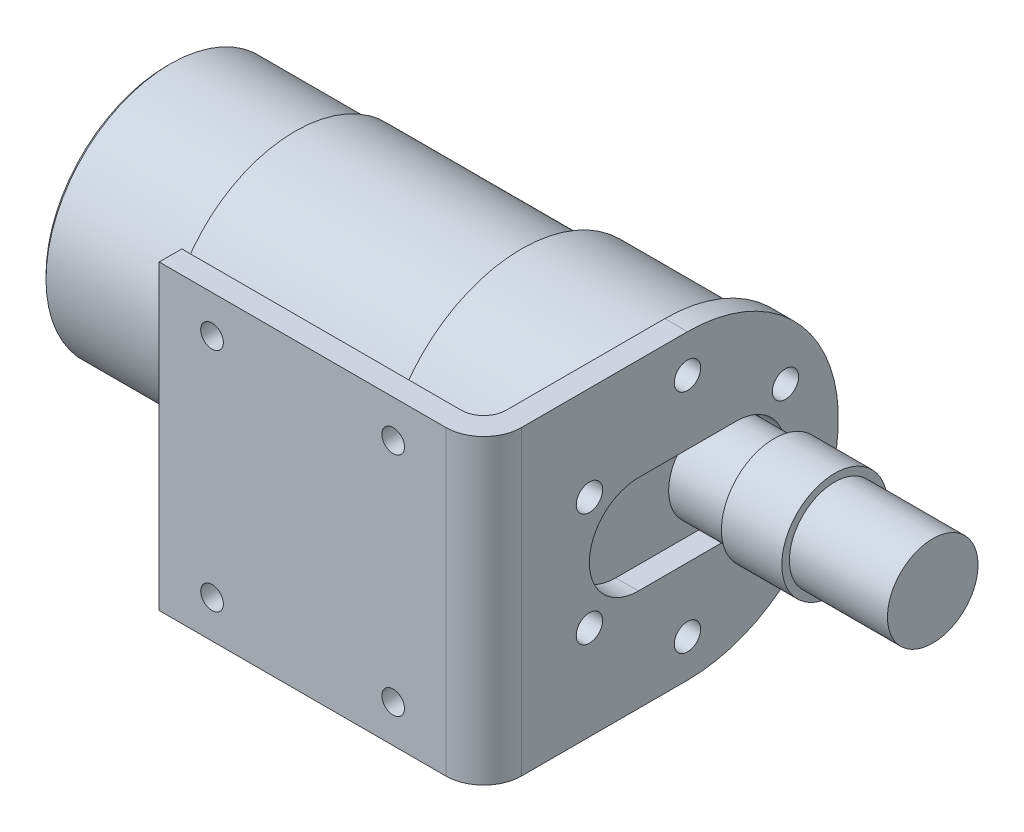
ISO-10303-21;
HEADER;
FILE_DESCRIPTION(('STEP AP214'),'2;1');
FILE_NAME('part.step','',(''),(''),'','','');
FILE_SCHEMA(('AUTOMOTIVE_DESIGN { 1 0 10303 214 1 1 1 1 }'));
ENDSEC;
DATA;
#1=APPLICATION_CONTEXT('core data for automotive mechanical design processes');
#2=APPLICATION_PROTOCOL_DEFINITION('international standard','automotive_design',2000,#1);
#3=PRODUCT_CONTEXT('',#1,'mechanical');
#4=PRODUCT('Part','Part','',(#3));
#5=PRODUCT_RELATED_PRODUCT_CATEGORY('part','',(#4));
#6=PRODUCT_DEFINITION_FORMATION('','',#4);
#7=PRODUCT_DEFINITION_CONTEXT('part definition',#1,'design');
#8=PRODUCT_DEFINITION('design','',#6,#7);
#9=PRODUCT_DEFINITION_SHAPE('','',#8);
#10=(LENGTH_UNIT() NAMED_UNIT(*) SI_UNIT(.MILLI.,.METRE.));
#11=(NAMED_UNIT(*) PLANE_ANGLE_UNIT() SI_UNIT($,.RADIAN.));
#12=(NAMED_UNIT(*) SI_UNIT($,.STERADIAN.) SOLID_ANGLE_UNIT());
#13=UNCERTAINTY_MEASURE_WITH_UNIT(LENGTH_MEASURE(1.E-05),#10,'distance_accuracy_value','');
#14=(GEOMETRIC_REPRESENTATION_CONTEXT(3) GLOBAL_UNCERTAINTY_ASSIGNED_CONTEXT((#13)) GLOBAL_UNIT_ASSIGNED_CONTEXT((#10,
#11,#12)) REPRESENTATION_CONTEXT('',''));
#15=CARTESIAN_POINT('',(0.,0.,0.));
#16=DIRECTION('',(0.,0.,1.));
#17=DIRECTION('',(1.,0.,0.));
#18=AXIS2_PLACEMENT_3D('',#15,#16,#17);
#19=CARTESIAN_POINT('',(47.5,0.,28.5));
#20=DIRECTION('',(-1.,0.,0.));
#21=DIRECTION('',(0.,-1.,0.));
#22=AXIS2_PLACEMENT_3D('',#19,#20,#21);
#23=CYLINDRICAL_SURFACE('',#22,20.);
#24=CARTESIAN_POINT('',(47.5,0.,28.5));
#25=DIRECTION('',(-1.,0.,0.));
#26=DIRECTION('',(0.,-1.,0.));
#27=AXIS2_PLACEMENT_3D('',#24,#25,#26);
#28=CIRCLE('',#27,20.);
#29=CARTESIAN_POINT('',(47.5,20.,28.5));
#30=VERTEX_POINT('',#29);
#31=CARTESIAN_POINT('',(47.5,-20.,28.5));
#32=VERTEX_POINT('',#31);
#33=EDGE_CURVE('P0_E298',#30,#32,#28,.T.);
#34=ORIENTED_EDGE('',*,*,#33,.F.);
#35=DIRECTION('',(1.,0.,0.));
#36=VECTOR('',#35,1.);
#37=CARTESIAN_POINT('',(47.5,20.,28.5));
#38=LINE('',#37,#36);
#39=CARTESIAN_POINT('',(50.5,20.,28.5));
#40=VERTEX_POINT('',#39);
#41=EDGE_CURVE('P0_E417',#30,#40,#38,.T.);
#42=ORIENTED_EDGE('',*,*,#41,.T.);
#43=CARTESIAN_POINT('',(50.5,0.,28.5));
#44=DIRECTION('',(-1.,0.,0.));
#45=DIRECTION('',(0.,-1.,0.));
#46=AXIS2_PLACEMENT_3D('',#43,#44,#45);
#47=CIRCLE('',#46,20.);
#48=CARTESIAN_POINT('',(50.5,-20.,28.5));
#49=VERTEX_POINT('',#48);
#50=EDGE_CURVE('P0_E331',#40,#49,#47,.T.);
#51=ORIENTED_EDGE('',*,*,#50,.T.);
#52=DIRECTION('',(1.,0.,0.));
#53=VECTOR('',#52,1.);
#54=CARTESIAN_POINT('',(47.5,-20.,28.5));
#55=LINE('',#54,#53);
#56=EDGE_CURVE('P0_E11',#32,#49,#55,.T.);
#57=ORIENTED_EDGE('',*,*,#56,.F.);
#58=EDGE_LOOP('',(#34,#42,#51,#57));
#59=FACE_BOUND('',#58,.T.);
#60=ADVANCED_FACE('P0_F16',(#59),#23,.T.);
#61=CARTESIAN_POINT('',(47.5,-20.,28.5));
#62=DIRECTION('',(0.,1.,0.));
#63=DIRECTION('',(1.,0.,0.));
#64=AXIS2_PLACEMENT_3D('',#61,#62,#63);
#65=PLANE('',#64);
#66=CARTESIAN_POINT('',(45.5,-20.,50.5));
#67=DIRECTION('',(0.,-1.,0.));
#68=DIRECTION('',(0.707106781186548,0.,0.707106781186548));
#69=AXIS2_PLACEMENT_3D('',#66,#67,#68);
#70=CIRCLE('',#69,5.);
#71=CARTESIAN_POINT('',(50.5,-20.,50.5));
#72=VERTEX_POINT('',#71);
#73=CARTESIAN_POINT('',(45.5,-20.,55.5));
#74=VERTEX_POINT('',#73);
#75=EDGE_CURVE('P0_E321',#72,#74,#70,.T.);
#76=ORIENTED_EDGE('',*,*,#75,.T.);
#77=DIRECTION('',(1.,0.,0.));
#78=VECTOR('',#77,1.);
#79=CARTESIAN_POINT('',(47.5,-20.,55.5));
#80=LINE('',#79,#78);
#81=CARTESIAN_POINT('',(7.5,-20.,55.5));
#82=VERTEX_POINT('',#81);
#83=EDGE_CURVE('P0_E27',#82,#74,#80,.T.);
#84=ORIENTED_EDGE('',*,*,#83,.F.);
#85=DIRECTION('',(0.,0.,-1.));
#86=VECTOR('',#85,1.);
#87=CARTESIAN_POINT('',(7.5,-20.,52.5));
#88=LINE('',#87,#86);
#89=CARTESIAN_POINT('',(7.5,-20.,52.5));
#90=VERTEX_POINT('',#89);
#91=EDGE_CURVE('P0_E20',#82,#90,#88,.T.);
#92=ORIENTED_EDGE('',*,*,#91,.T.);
#93=DIRECTION('',(-1.,0.,0.));
#94=VECTOR('',#93,1.);
#95=CARTESIAN_POINT('',(47.5,-20.,52.5));
#96=LINE('',#95,#94);
#97=CARTESIAN_POINT('',(44.5,-20.,52.5));
#98=VERTEX_POINT('',#97);
#99=EDGE_CURVE('P0_E272',#98,#90,#96,.T.);
#100=ORIENTED_EDGE('',*,*,#99,.F.);
#101=CARTESIAN_POINT('',(44.5,-20.,49.5));
#102=DIRECTION('',(0.,1.,0.));
#103=DIRECTION('',(0.707106781186548,0.,0.707106781186548));
#104=AXIS2_PLACEMENT_3D('',#101,#102,#103);
#105=CIRCLE('',#104,3.);
#106=CARTESIAN_POINT('',(47.5,-20.,49.5));
#107=VERTEX_POINT('',#106);
#108=EDGE_CURVE('P0_E262',#98,#107,#105,.T.);
#109=ORIENTED_EDGE('',*,*,#108,.T.);
#110=DIRECTION('',(0.,0.,-1.));
#111=VECTOR('',#110,1.);
#112=CARTESIAN_POINT('',(47.5,-20.,55.5));
#113=LINE('',#112,#111);
#114=EDGE_CURVE('P0_E268',#107,#32,#113,.T.);
#115=ORIENTED_EDGE('',*,*,#114,.T.);
#116=ORIENTED_EDGE('',*,*,#56,.T.);
#117=DIRECTION('',(0.,0.,1.));
#118=VECTOR('',#117,1.);
#119=CARTESIAN_POINT('',(50.5,-20.,55.5));
#120=LINE('',#119,#118);
#121=EDGE_CURVE('P0_E342',#49,#72,#120,.T.);
#122=ORIENTED_EDGE('',*,*,#121,.T.);
#123=EDGE_LOOP('',(#76,#84,#92,#100,#109,#115,#116,#122));
#124=FACE_BOUND('',#123,.T.);
#125=ADVANCED_FACE('P0_F387',(#124),#65,.F.);
#126=CARTESIAN_POINT('',(47.5,-20.,55.5));
#127=DIRECTION('',(0.,0.,-1.));
#128=DIRECTION('',(0.,-1.,0.));
#129=AXIS2_PLACEMENT_3D('',#126,#127,#128);
#130=PLANE('',#129);
#131=CARTESIAN_POINT('',(14.5,15.,55.5));
#132=DIRECTION('',(0.,0.,-1.));
#133=DIRECTION('',(1.,0.,0.));
#134=AXIS2_PLACEMENT_3D('',#131,#132,#133);
#135=CIRCLE('',#134,1.5);
#136=CARTESIAN_POINT('',(13.,15.,55.5));
#137=VERTEX_POINT('',#136);
#138=EDGE_CURVE('P0_E341',#137,#137,#135,.T.);
#139=ORIENTED_EDGE('',*,*,#138,.T.);
#140=EDGE_LOOP('',(#139));
#141=FACE_BOUND('',#140,.T.);
#142=CARTESIAN_POINT('',(14.5,-15.,55.5));
#143=DIRECTION('',(0.,0.,-1.));
#144=DIRECTION('',(1.,0.,0.));
#145=AXIS2_PLACEMENT_3D('',#142,#143,#144);
#146=CIRCLE('',#145,1.5);
#147=CARTESIAN_POINT('',(13.,-15.,55.5));
#148=VERTEX_POINT('',#147);
#149=EDGE_CURVE('P0_E332',#148,#148,#146,.T.);
#150=ORIENTED_EDGE('',*,*,#149,.T.);
#151=EDGE_LOOP('',(#150));
#152=FACE_BOUND('',#151,.T.);
#153=CARTESIAN_POINT('',(38.5,15.,55.5));
#154=DIRECTION('',(0.,0.,-1.));
#155=DIRECTION('',(1.,0.,0.));
#156=AXIS2_PLACEMENT_3D('',#153,#154,#155);
#157=CIRCLE('',#156,1.5);
#158=CARTESIAN_POINT('',(37.,15.,55.5));
#159=VERTEX_POINT('',#158);
#160=EDGE_CURVE('P0_E290',#159,#159,#157,.T.);
#161=ORIENTED_EDGE('',*,*,#160,.T.);
#162=EDGE_LOOP('',(#161));
#163=FACE_BOUND('',#162,.T.);
#164=CARTESIAN_POINT('',(38.5,-15.,55.5));
#165=DIRECTION('',(0.,0.,-1.));
#166=DIRECTION('',(1.,0.,0.));
#167=AXIS2_PLACEMENT_3D('',#164,#165,#166);
#168=CIRCLE('',#167,1.5);
#169=CARTESIAN_POINT('',(37.,-15.,55.5));
#170=VERTEX_POINT('',#169);
#171=EDGE_CURVE('P0_E363',#170,#170,#168,.T.);
#172=ORIENTED_EDGE('',*,*,#171,.T.);
#173=EDGE_LOOP('',(#172));
#174=FACE_BOUND('',#173,.T.);
#175=DIRECTION('',(0.,1.,0.));
#176=VECTOR('',#175,1.);
#177=CARTESIAN_POINT('',(45.5,-10.,55.5));
#178=LINE('',#177,#176);
#179=CARTESIAN_POINT('',(45.5,20.,55.5));
#180=VERTEX_POINT('',#179);
#181=EDGE_CURVE('P0_E317',#74,#180,#178,.T.);
#182=ORIENTED_EDGE('',*,*,#181,.T.);
#183=DIRECTION('',(1.,0.,0.));
#184=VECTOR('',#183,1.);
#185=CARTESIAN_POINT('',(47.5,20.,55.5));
#186=LINE('',#185,#184);
#187=CARTESIAN_POINT('',(7.5,20.,55.5));
#188=VERTEX_POINT('',#187);
#189=EDGE_CURVE('P0_E281',#188,#180,#186,.T.);
#190=ORIENTED_EDGE('',*,*,#189,.F.);
#191=DIRECTION('',(0.,-1.,0.));
#192=VECTOR('',#191,1.);
#193=CARTESIAN_POINT('',(7.5,-20.,55.5));
#194=LINE('',#193,#192);
#195=EDGE_CURVE('P0_E302',#188,#82,#194,.T.);
#196=ORIENTED_EDGE('',*,*,#195,.T.);
#197=ORIENTED_EDGE('',*,*,#83,.T.);
#198=EDGE_LOOP('',(#182,#190,#196,#197));
#199=FACE_BOUND('',#198,.T.);
#200=ADVANCED_FACE('P0_F440',(#141,#152,#163,#174,#199),#130,.F.);
#201=CARTESIAN_POINT('',(47.5,7.5,15.5096189432334));
#202=DIRECTION('',(-1.,0.,0.));
#203=DIRECTION('',(0.,-1.,0.));
#204=AXIS2_PLACEMENT_3D('',#201,#202,#203);
#205=CYLINDRICAL_SURFACE('',#204,1.75);
#206=CARTESIAN_POINT('',(50.5,7.5,15.5096189432334));
#207=DIRECTION('',(1.,0.,0.));
#208=DIRECTION('',(0.,-1.,0.));
#209=AXIS2_PLACEMENT_3D('',#206,#207,#208);
#210=CIRCLE('',#209,1.75);
#211=CARTESIAN_POINT('',(50.5,9.25,15.5096189432334));
#212=VERTEX_POINT('',#211);
#213=EDGE_CURVE('P0_E409',#212,#212,#210,.T.);
#214=ORIENTED_EDGE('',*,*,#213,.T.);
#215=DIRECTION('',(-1.,0.,0.));
#216=VECTOR('',#215,1.);
#217=CARTESIAN_POINT('',(47.5,9.25,15.5096189432334));
#218=LINE('',#217,#216);
#219=CARTESIAN_POINT('',(47.5,9.25,15.5096189432334));
#220=VERTEX_POINT('',#219);
#221=EDGE_CURVE('P0_E40',#212,#220,#218,.T.);
#222=ORIENTED_EDGE('',*,*,#221,.T.);
#223=CARTESIAN_POINT('',(47.5,7.5,15.5096189432334));
#224=DIRECTION('',(1.,0.,0.));
#225=DIRECTION('',(0.,-1.,0.));
#226=AXIS2_PLACEMENT_3D('',#223,#224,#225);
#227=CIRCLE('',#226,1.75);
#228=EDGE_CURVE('P0_E284',#220,#220,#227,.T.);
#229=ORIENTED_EDGE('',*,*,#228,.F.);
#230=ORIENTED_EDGE('',*,*,#221,.F.);
#231=EDGE_LOOP('',(#214,#222,#229,#230));
#232=FACE_BOUND('',#231,.T.);
#233=ADVANCED_FACE('P0_F499',(#232),#205,.F.);
#234=CARTESIAN_POINT('',(47.5,15.,28.5));
#235=DIRECTION('',(-1.,0.,0.));
#236=DIRECTION('',(0.,-1.,0.));
#237=AXIS2_PLACEMENT_3D('',#234,#235,#236);
#238=CYLINDRICAL_SURFACE('',#237,1.75);
#239=CARTESIAN_POINT('',(50.5,15.,28.5));
#240=DIRECTION('',(1.,0.,0.));
#241=DIRECTION('',(0.,-1.,0.));
#242=AXIS2_PLACEMENT_3D('',#239,#240,#241);
#243=CIRCLE('',#242,1.75);
#244=CARTESIAN_POINT('',(50.5,16.75,28.5));
#245=VERTEX_POINT('',#244);
#246=EDGE_CURVE('P0_E241',#245,#245,#243,.T.);
#247=ORIENTED_EDGE('',*,*,#246,.T.);
#248=DIRECTION('',(-1.,0.,0.));
#249=VECTOR('',#248,1.);
#250=CARTESIAN_POINT('',(47.5,16.75,28.5));
#251=LINE('',#250,#249);
#252=CARTESIAN_POINT('',(47.5,16.75,28.5));
#253=VERTEX_POINT('',#252);
#254=EDGE_CURVE('P0_E230',#245,#253,#251,.T.);
#255=ORIENTED_EDGE('',*,*,#254,.T.);
#256=CARTESIAN_POINT('',(47.5,15.,28.5));
#257=DIRECTION('',(1.,0.,0.));
#258=DIRECTION('',(0.,-1.,0.));
#259=AXIS2_PLACEMENT_3D('',#256,#257,#258);
#260=CIRCLE('',#259,1.75);
#261=EDGE_CURVE('P0_E303',#253,#253,#260,.T.);
#262=ORIENTED_EDGE('',*,*,#261,.F.);
#263=ORIENTED_EDGE('',*,*,#254,.F.);
#264=EDGE_LOOP('',(#247,#255,#262,#263));
#265=FACE_BOUND('',#264,.T.);
#266=ADVANCED_FACE('P0_F573',(#265),#238,.F.);
#267=CARTESIAN_POINT('',(47.5,0.,35.));
#268=DIRECTION('',(-1.,0.,0.));
#269=DIRECTION('',(0.,-1.,0.));
#270=AXIS2_PLACEMENT_3D('',#267,#268,#269);
#271=CYLINDRICAL_SURFACE('',#270,6.50000000000062);
#272=CARTESIAN_POINT('',(47.5,0.,35.));
#273=DIRECTION('',(1.,0.,0.));
#274=DIRECTION('',(0.,-1.,0.));
#275=AXIS2_PLACEMENT_3D('',#272,#273,#274);
#276=CIRCLE('',#275,6.50000000000062);
#277=CARTESIAN_POINT('',(47.5,6.50000000000064,35.));
#278=VERTEX_POINT('',#277);
#279=CARTESIAN_POINT('',(47.5,-6.5000000000006,35.));
#280=VERTEX_POINT('',#279);
#281=EDGE_CURVE('P0_E425',#278,#280,#276,.T.);
#282=ORIENTED_EDGE('',*,*,#281,.F.);
#283=DIRECTION('',(1.,0.,0.));
#284=VECTOR('',#283,1.);
#285=CARTESIAN_POINT('',(47.5,6.50000000000064,35.));
#286=LINE('',#285,#284);
#287=CARTESIAN_POINT('',(50.5,6.50000000000064,35.));
#288=VERTEX_POINT('',#287);
#289=EDGE_CURVE('P0_E245',#278,#288,#286,.T.);
#290=ORIENTED_EDGE('',*,*,#289,.T.);
#291=CARTESIAN_POINT('',(50.5,0.,35.));
#292=DIRECTION('',(1.,0.,0.));
#293=DIRECTION('',(0.,-1.,0.));
#294=AXIS2_PLACEMENT_3D('',#291,#292,#293);
#295=CIRCLE('',#294,6.50000000000062);
#296=CARTESIAN_POINT('',(50.5,-6.5000000000006,35.));
#297=VERTEX_POINT('',#296);
#298=EDGE_CURVE('P0_E237',#288,#297,#295,.T.);
#299=ORIENTED_EDGE('',*,*,#298,.T.);
#300=DIRECTION('',(1.,0.,0.));
#301=VECTOR('',#300,1.);
#302=CARTESIAN_POINT('',(47.5,-6.5000000000006,35.));
#303=LINE('',#302,#301);
#304=EDGE_CURVE('P0_E218',#280,#297,#303,.T.);
#305=ORIENTED_EDGE('',*,*,#304,.F.);
#306=EDGE_LOOP('',(#282,#290,#299,#305));
#307=FACE_BOUND('',#306,.T.);
#308=ADVANCED_FACE('P0_F243',(#307),#271,.F.);
#309=CARTESIAN_POINT('',(47.5,-6.5000000000006,35.));
#310=DIRECTION('',(0.,-1.,0.));
#311=DIRECTION('',(-1.,0.,0.));
#312=AXIS2_PLACEMENT_3D('',#309,#310,#311);
#313=PLANE('',#312);
#314=DIRECTION('',(0.,0.,-1.));
#315=VECTOR('',#314,1.);
#316=CARTESIAN_POINT('',(47.5,-6.50000000000062,22.));
#317=LINE('',#316,#315);
#318=CARTESIAN_POINT('',(47.5,-6.50000000000062,22.));
#319=VERTEX_POINT('',#318);
#320=EDGE_CURVE('P0_E224',#280,#319,#317,.T.);
#321=ORIENTED_EDGE('',*,*,#320,.F.);
#322=ORIENTED_EDGE('',*,*,#304,.T.);
#323=DIRECTION('',(0.,0.,-1.));
#324=VECTOR('',#323,1.);
#325=CARTESIAN_POINT('',(50.5,-6.50000000000062,22.));
#326=LINE('',#325,#324);
#327=CARTESIAN_POINT('',(50.5,-6.50000000000062,22.));
#328=VERTEX_POINT('',#327);
#329=EDGE_CURVE('P0_E221',#297,#328,#326,.T.);
#330=ORIENTED_EDGE('',*,*,#329,.T.);
#331=DIRECTION('',(1.,0.,0.));
#332=VECTOR('',#331,1.);
#333=CARTESIAN_POINT('',(47.5,-6.50000000000062,22.));
#334=LINE('',#333,#332);
#335=EDGE_CURVE('P0_E231',#319,#328,#334,.T.);
#336=ORIENTED_EDGE('',*,*,#335,.F.);
#337=EDGE_LOOP('',(#321,#322,#330,#336));
#338=FACE_BOUND('',#337,.T.);
#339=ADVANCED_FACE('P0_F220',(#338),#313,.F.);
#340=CARTESIAN_POINT('',(47.5,0.,22.));
#341=DIRECTION('',(-1.,0.,0.));
#342=DIRECTION('',(0.,1.,0.));
#343=AXIS2_PLACEMENT_3D('',#340,#341,#342);
#344=CYLINDRICAL_SURFACE('',#343,6.50000000000023);
#345=CARTESIAN_POINT('',(47.5,0.,22.));
#346=DIRECTION('',(1.,0.,0.));
#347=DIRECTION('',(0.,1.,0.));
#348=AXIS2_PLACEMENT_3D('',#345,#346,#347);
#349=CIRCLE('',#348,6.50000000000023);
#350=CARTESIAN_POINT('',(47.5,6.50000000000025,22.));
#351=VERTEX_POINT('',#350);
#352=EDGE_CURVE('P0_E402',#319,#351,#349,.T.);
#353=ORIENTED_EDGE('',*,*,#352,.F.);
#354=ORIENTED_EDGE('',*,*,#335,.T.);
#355=CARTESIAN_POINT('',(50.5,0.,22.));
#356=DIRECTION('',(1.,0.,0.));
#357=DIRECTION('',(0.,1.,0.));
#358=AXIS2_PLACEMENT_3D('',#355,#356,#357);
#359=CIRCLE('',#358,6.50000000000023);
#360=CARTESIAN_POINT('',(50.5,6.50000000000025,22.));
#361=VERTEX_POINT('',#360);
#362=EDGE_CURVE('P0_E239',#328,#361,#359,.T.);
#363=ORIENTED_EDGE('',*,*,#362,.T.);
#364=DIRECTION('',(1.,0.,0.));
#365=VECTOR('',#364,1.);
#366=CARTESIAN_POINT('',(47.5,6.50000000000025,22.));
#367=LINE('',#366,#365);
#368=EDGE_CURVE('P0_E356',#351,#361,#367,.T.);
#369=ORIENTED_EDGE('',*,*,#368,.F.);
#370=EDGE_LOOP('',(#353,#354,#363,#369));
#371=FACE_BOUND('',#370,.T.);
#372=ADVANCED_FACE('P0_F579',(#371),#344,.F.);
#373=CARTESIAN_POINT('',(47.5,6.50000000000025,22.));
#374=DIRECTION('',(0.,1.,0.));
#375=DIRECTION('',(0.,0.,-1.));
#376=AXIS2_PLACEMENT_3D('',#373,#374,#375);
#377=PLANE('',#376);
#378=DIRECTION('',(0.,0.,1.));
#379=VECTOR('',#378,1.);
#380=CARTESIAN_POINT('',(47.5,6.50000000000056,35.));
#381=LINE('',#380,#379);
#382=EDGE_CURVE('P0_E307',#351,#278,#381,.T.);
#383=ORIENTED_EDGE('',*,*,#382,.F.);
#384=ORIENTED_EDGE('',*,*,#368,.T.);
#385=DIRECTION('',(0.,0.,1.));
#386=VECTOR('',#385,1.);
#387=CARTESIAN_POINT('',(50.5,6.50000000000056,35.));
#388=LINE('',#387,#386);
#389=EDGE_CURVE('P0_E248',#361,#288,#388,.T.);
#390=ORIENTED_EDGE('',*,*,#389,.T.);
#391=ORIENTED_EDGE('',*,*,#289,.F.);
#392=EDGE_LOOP('',(#383,#384,#390,#391));
#393=FACE_BOUND('',#392,.T.);
#394=ADVANCED_FACE('P0_F18',(#393),#377,.F.);
#395=CARTESIAN_POINT('',(47.5,-15.,28.5));
#396=DIRECTION('',(-1.,0.,0.));
#397=DIRECTION('',(0.,-1.,0.));
#398=AXIS2_PLACEMENT_3D('',#395,#396,#397);
#399=CYLINDRICAL_SURFACE('',#398,1.75);
#400=CARTESIAN_POINT('',(50.5,-15.,28.5));
#401=DIRECTION('',(1.,0.,0.));
#402=DIRECTION('',(0.,-1.,0.));
#403=AXIS2_PLACEMENT_3D('',#400,#401,#402);
#404=CIRCLE('',#403,1.75);
#405=CARTESIAN_POINT('',(50.5,-13.25,28.5));
#406=VERTEX_POINT('',#405);
#407=EDGE_CURVE('P0_E249',#406,#406,#404,.T.);
#408=ORIENTED_EDGE('',*,*,#407,.T.);
#409=DIRECTION('',(-1.,0.,0.));
#410=VECTOR('',#409,1.);
#411=CARTESIAN_POINT('',(47.5,-13.25,28.5));
#412=LINE('',#411,#410);
#413=CARTESIAN_POINT('',(47.5,-13.25,28.5));
#414=VERTEX_POINT('',#413);
#415=EDGE_CURVE('P0_E353',#406,#414,#412,.T.);
#416=ORIENTED_EDGE('',*,*,#415,.T.);
#417=CARTESIAN_POINT('',(47.5,-15.,28.5));
#418=DIRECTION('',(1.,0.,0.));
#419=DIRECTION('',(0.,-1.,0.));
#420=AXIS2_PLACEMENT_3D('',#417,#418,#419);
#421=CIRCLE('',#420,1.75);
#422=EDGE_CURVE('P0_E316',#414,#414,#421,.T.);
#423=ORIENTED_EDGE('',*,*,#422,.F.);
#424=ORIENTED_EDGE('',*,*,#415,.F.);
#425=EDGE_LOOP('',(#408,#416,#423,#424));
#426=FACE_BOUND('',#425,.T.);
#427=ADVANCED_FACE('P0_F550',(#426),#399,.F.);
#428=CARTESIAN_POINT('',(47.5,7.5,41.4903810567666));
#429=DIRECTION('',(-1.,0.,0.));
#430=DIRECTION('',(0.,-1.,0.));
#431=AXIS2_PLACEMENT_3D('',#428,#429,#430);
#432=CYLINDRICAL_SURFACE('',#431,1.75);
#433=CARTESIAN_POINT('',(50.5,7.5,41.4903810567666));
#434=DIRECTION('',(1.,0.,0.));
#435=DIRECTION('',(0.,-1.,0.));
#436=AXIS2_PLACEMENT_3D('',#433,#434,#435);
#437=CIRCLE('',#436,1.75);
#438=CARTESIAN_POINT('',(50.5,9.25,41.4903810567666));
#439=VERTEX_POINT('',#438);
#440=EDGE_CURVE('P0_E258',#439,#439,#437,.T.);
#441=ORIENTED_EDGE('',*,*,#440,.T.);
#442=DIRECTION('',(-1.,0.,0.));
#443=VECTOR('',#442,1.);
#444=CARTESIAN_POINT('',(47.5,9.25,41.4903810567666));
#445=LINE('',#444,#443);
#446=CARTESIAN_POINT('',(47.5,9.25,41.4903810567666));
#447=VERTEX_POINT('',#446);
#448=EDGE_CURVE('P0_E287',#439,#447,#445,.T.);
#449=ORIENTED_EDGE('',*,*,#448,.T.);
#450=CARTESIAN_POINT('',(47.5,7.5,41.4903810567666));
#451=DIRECTION('',(1.,0.,0.));
#452=DIRECTION('',(0.,-1.,0.));
#453=AXIS2_PLACEMENT_3D('',#450,#451,#452);
#454=CIRCLE('',#453,1.75);
#455=EDGE_CURVE('P0_E271',#447,#447,#454,.T.);
#456=ORIENTED_EDGE('',*,*,#455,.F.);
#457=ORIENTED_EDGE('',*,*,#448,.F.);
#458=EDGE_LOOP('',(#441,#449,#456,#457));
#459=FACE_BOUND('',#458,.T.);
#460=ADVANCED_FACE('P0_F544',(#459),#432,.F.);
#461=CARTESIAN_POINT('',(47.5,-7.5,15.5096189432334));
#462=DIRECTION('',(-1.,0.,0.));
#463=DIRECTION('',(0.,-1.,0.));
#464=AXIS2_PLACEMENT_3D('',#461,#462,#463);
#465=CYLINDRICAL_SURFACE('',#464,1.75);
#466=CARTESIAN_POINT('',(50.5,-7.5,15.5096189432334));
#467=DIRECTION('',(1.,0.,0.));
#468=DIRECTION('',(0.,-1.,0.));
#469=AXIS2_PLACEMENT_3D('',#466,#467,#468);
#470=CIRCLE('',#469,1.75);
#471=CARTESIAN_POINT('',(50.5,-5.75,15.5096189432334));
#472=VERTEX_POINT('',#471);
#473=EDGE_CURVE('P0_E457',#472,#472,#470,.T.);
#474=ORIENTED_EDGE('',*,*,#473,.T.);
#475=DIRECTION('',(-1.,0.,0.));
#476=VECTOR('',#475,1.);
#477=CARTESIAN_POINT('',(47.5,-5.75,15.5096189432334));
#478=LINE('',#477,#476);
#479=CARTESIAN_POINT('',(47.5,-5.75,15.5096189432334));
#480=VERTEX_POINT('',#479);
#481=EDGE_CURVE('P0_E191',#472,#480,#478,.T.);
#482=ORIENTED_EDGE('',*,*,#481,.T.);
#483=CARTESIAN_POINT('',(47.5,-7.5,15.5096189432334));
#484=DIRECTION('',(1.,0.,0.));
#485=DIRECTION('',(0.,-1.,0.));
#486=AXIS2_PLACEMENT_3D('',#483,#484,#485);
#487=CIRCLE('',#486,1.75);
#488=EDGE_CURVE('P0_E267',#480,#480,#487,.T.);
#489=ORIENTED_EDGE('',*,*,#488,.F.);
#490=ORIENTED_EDGE('',*,*,#481,.F.);
#491=EDGE_LOOP('',(#474,#482,#489,#490));
#492=FACE_BOUND('',#491,.T.);
#493=ADVANCED_FACE('P0_F540',(#492),#465,.F.);
#494=CARTESIAN_POINT('',(47.5,-7.5,41.4903810567666));
#495=DIRECTION('',(-1.,0.,0.));
#496=DIRECTION('',(0.,-1.,0.));
#497=AXIS2_PLACEMENT_3D('',#494,#495,#496);
#498=CYLINDRICAL_SURFACE('',#497,1.75);
#499=CARTESIAN_POINT('',(50.5,-7.5,41.4903810567666));
#500=DIRECTION('',(1.,0.,0.));
#501=DIRECTION('',(0.,-1.,0.));
#502=AXIS2_PLACEMENT_3D('',#499,#500,#501);
#503=CIRCLE('',#502,1.75);
#504=CARTESIAN_POINT('',(50.5,-5.75,41.4903810567666));
#505=VERTEX_POINT('',#504);
#506=EDGE_CURVE('P0_E330',#505,#505,#503,.T.);
#507=ORIENTED_EDGE('',*,*,#506,.T.);
#508=DIRECTION('',(-1.,0.,0.));
#509=VECTOR('',#508,1.);
#510=CARTESIAN_POINT('',(47.5,-5.75,41.4903810567666));
#511=LINE('',#510,#509);
#512=CARTESIAN_POINT('',(47.5,-5.75,41.4903810567666));
#513=VERTEX_POINT('',#512);
#514=EDGE_CURVE('P0_E179',#505,#513,#511,.T.);
#515=ORIENTED_EDGE('',*,*,#514,.T.);
#516=CARTESIAN_POINT('',(47.5,-7.5,41.4903810567666));
#517=DIRECTION('',(1.,0.,0.));
#518=DIRECTION('',(0.,-1.,0.));
#519=AXIS2_PLACEMENT_3D('',#516,#517,#518);
#520=CIRCLE('',#519,1.75);
#521=EDGE_CURVE('P0_E264',#513,#513,#520,.T.);
#522=ORIENTED_EDGE('',*,*,#521,.F.);
#523=ORIENTED_EDGE('',*,*,#514,.F.);
#524=EDGE_LOOP('',(#507,#515,#522,#523));
#525=FACE_BOUND('',#524,.T.);
#526=ADVANCED_FACE('P0_F543',(#525),#498,.F.);
#527=CARTESIAN_POINT('',(47.5,0.,32.));
#528=DIRECTION('',(-1.,0.,0.));
#529=DIRECTION('',(0.,1.,0.));
#530=AXIS2_PLACEMENT_3D('',#527,#528,#529);
#531=PLANE('',#530);
#532=ORIENTED_EDGE('',*,*,#228,.T.);
#533=EDGE_LOOP('',(#532));
#534=FACE_BOUND('',#533,.T.);
#535=ORIENTED_EDGE('',*,*,#261,.T.);
#536=EDGE_LOOP('',(#535));
#537=FACE_BOUND('',#536,.T.);
#538=ORIENTED_EDGE('',*,*,#281,.T.);
#539=ORIENTED_EDGE('',*,*,#320,.T.);
#540=ORIENTED_EDGE('',*,*,#352,.T.);
#541=ORIENTED_EDGE('',*,*,#382,.T.);
#542=EDGE_LOOP('',(#538,#539,#540,#541));
#543=FACE_BOUND('',#542,.T.);
#544=ORIENTED_EDGE('',*,*,#422,.T.);
#545=EDGE_LOOP('',(#544));
#546=FACE_BOUND('',#545,.T.);
#547=ORIENTED_EDGE('',*,*,#455,.T.);
#548=EDGE_LOOP('',(#547));
#549=FACE_BOUND('',#548,.T.);
#550=ORIENTED_EDGE('',*,*,#488,.T.);
#551=EDGE_LOOP('',(#550));
#552=FACE_BOUND('',#551,.T.);
#553=ORIENTED_EDGE('',*,*,#521,.T.);
#554=EDGE_LOOP('',(#553));
#555=FACE_BOUND('',#554,.T.);
#556=DIRECTION('',(0.,1.,0.));
#557=VECTOR('',#556,1.);
#558=CARTESIAN_POINT('',(47.5,-10.,49.5));
#559=LINE('',#558,#557);
#560=CARTESIAN_POINT('',(47.5,20.,49.5));
#561=VERTEX_POINT('',#560);
#562=EDGE_CURVE('P0_E278',#107,#561,#559,.T.);
#563=ORIENTED_EDGE('',*,*,#562,.T.);
#564=DIRECTION('',(0.,0.,1.));
#565=VECTOR('',#564,1.);
#566=CARTESIAN_POINT('',(47.5,20.,28.5));
#567=LINE('',#566,#565);
#568=EDGE_CURVE('P0_E371',#30,#561,#567,.T.);
#569=ORIENTED_EDGE('',*,*,#568,.F.);
#570=ORIENTED_EDGE('',*,*,#33,.T.);
#571=ORIENTED_EDGE('',*,*,#114,.F.);
#572=EDGE_LOOP('',(#563,#569,#570,#571));
#573=FACE_BOUND('',#572,.T.);
#574=ADVANCED_FACE('P0_F394',(#534,#537,#543,#546,#549,#552,#555,#573),#531,.T.);
#575=CARTESIAN_POINT('',(7.5,0.,54.));
#576=DIRECTION('',(1.,0.,0.));
#577=DIRECTION('',(0.,1.,0.));
#578=AXIS2_PLACEMENT_3D('',#575,#576,#577);
#579=PLANE('',#578);
#580=DIRECTION('',(0.,1.,0.));
#581=VECTOR('',#580,1.);
#582=CARTESIAN_POINT('',(7.5,20.,52.5));
#583=LINE('',#582,#581);
#584=CARTESIAN_POINT('',(7.5,20.,52.5));
#585=VERTEX_POINT('',#584);
#586=EDGE_CURVE('P0_E276',#90,#585,#583,.T.);
#587=ORIENTED_EDGE('',*,*,#586,.F.);
#588=ORIENTED_EDGE('',*,*,#91,.F.);
#589=ORIENTED_EDGE('',*,*,#195,.F.);
#590=DIRECTION('',(0.,0.,1.));
#591=VECTOR('',#590,1.);
#592=CARTESIAN_POINT('',(7.5,20.,55.5));
#593=LINE('',#592,#591);
#594=EDGE_CURVE('P0_E293',#585,#188,#593,.T.);
#595=ORIENTED_EDGE('',*,*,#594,.F.);
#596=EDGE_LOOP('',(#587,#588,#589,#595));
#597=FACE_BOUND('',#596,.T.);
#598=ADVANCED_FACE('P0_F511',(#597),#579,.F.);
#599=CARTESIAN_POINT('',(47.5,-20.,52.5));
#600=DIRECTION('',(0.,0.,1.));
#601=DIRECTION('',(0.,-1.,0.));
#602=AXIS2_PLACEMENT_3D('',#599,#600,#601);
#603=PLANE('',#602);
#604=CARTESIAN_POINT('',(14.5,15.,52.5));
#605=DIRECTION('',(0.,0.,1.));
#606=DIRECTION('',(1.,0.,0.));
#607=AXIS2_PLACEMENT_3D('',#604,#605,#606);
#608=CIRCLE('',#607,1.5);
#609=CARTESIAN_POINT('',(13.,15.,52.5));
#610=VERTEX_POINT('',#609);
#611=EDGE_CURVE('P0_E308',#610,#610,#608,.T.);
#612=ORIENTED_EDGE('',*,*,#611,.T.);
#613=EDGE_LOOP('',(#612));
#614=FACE_BOUND('',#613,.T.);
#615=CARTESIAN_POINT('',(14.5,-15.,52.5));
#616=DIRECTION('',(0.,0.,1.));
#617=DIRECTION('',(1.,0.,0.));
#618=AXIS2_PLACEMENT_3D('',#615,#616,#617);
#619=CIRCLE('',#618,1.5);
#620=CARTESIAN_POINT('',(13.,-15.,52.5));
#621=VERTEX_POINT('',#620);
#622=EDGE_CURVE('P0_E410',#621,#621,#619,.T.);
#623=ORIENTED_EDGE('',*,*,#622,.T.);
#624=EDGE_LOOP('',(#623));
#625=FACE_BOUND('',#624,.T.);
#626=CARTESIAN_POINT('',(38.5,15.,52.5));
#627=DIRECTION('',(0.,0.,1.));
#628=DIRECTION('',(1.,0.,0.));
#629=AXIS2_PLACEMENT_3D('',#626,#627,#628);
#630=CIRCLE('',#629,1.5);
#631=CARTESIAN_POINT('',(37.,15.,52.5));
#632=VERTEX_POINT('',#631);
#633=EDGE_CURVE('P0_E337',#632,#632,#630,.T.);
#634=ORIENTED_EDGE('',*,*,#633,.T.);
#635=EDGE_LOOP('',(#634));
#636=FACE_BOUND('',#635,.T.);
#637=CARTESIAN_POINT('',(38.5,-15.,52.5));
#638=DIRECTION('',(0.,0.,1.));
#639=DIRECTION('',(1.,0.,0.));
#640=AXIS2_PLACEMENT_3D('',#637,#638,#639);
#641=CIRCLE('',#640,1.5);
#642=CARTESIAN_POINT('',(37.,-15.,52.5));
#643=VERTEX_POINT('',#642);
#644=EDGE_CURVE('P0_E288',#643,#643,#641,.T.);
#645=ORIENTED_EDGE('',*,*,#644,.T.);
#646=EDGE_LOOP('',(#645));
#647=FACE_BOUND('',#646,.T.);
#648=DIRECTION('',(0.,-1.,0.));
#649=VECTOR('',#648,1.);
#650=CARTESIAN_POINT('',(44.5,-10.,52.5));
#651=LINE('',#650,#649);
#652=CARTESIAN_POINT('',(44.5,20.,52.5));
#653=VERTEX_POINT('',#652);
#654=EDGE_CURVE('P0_E277',#653,#98,#651,.T.);
#655=ORIENTED_EDGE('',*,*,#654,.T.);
#656=ORIENTED_EDGE('',*,*,#99,.T.);
#657=ORIENTED_EDGE('',*,*,#586,.T.);
#658=DIRECTION('',(-1.,0.,0.));
#659=VECTOR('',#658,1.);
#660=CARTESIAN_POINT('',(47.5,20.,52.5));
#661=LINE('',#660,#659);
#662=EDGE_CURVE('P0_E297',#653,#585,#661,.T.);
#663=ORIENTED_EDGE('',*,*,#662,.F.);
#664=EDGE_LOOP('',(#655,#656,#657,#663));
#665=FACE_BOUND('',#664,.T.);
#666=ADVANCED_FACE('P0_F509',(#614,#625,#636,#647,#665),#603,.F.);
#667=CARTESIAN_POINT('',(44.5,-10.,49.5));
#668=DIRECTION('',(0.,1.,0.));
#669=DIRECTION('',(0.707106781186548,0.,0.707106781186548));
#670=AXIS2_PLACEMENT_3D('',#667,#668,#669);
#671=CYLINDRICAL_SURFACE('',#670,3.);
#672=CARTESIAN_POINT('',(44.5,20.,49.5));
#673=DIRECTION('',(0.,-1.,0.));
#674=DIRECTION('',(0.707106781186548,0.,0.707106781186548));
#675=AXIS2_PLACEMENT_3D('',#672,#673,#674);
#676=CIRCLE('',#675,3.);
#677=EDGE_CURVE('P0_E367',#561,#653,#676,.T.);
#678=ORIENTED_EDGE('',*,*,#677,.F.);
#679=ORIENTED_EDGE('',*,*,#562,.F.);
#680=ORIENTED_EDGE('',*,*,#108,.F.);
#681=ORIENTED_EDGE('',*,*,#654,.F.);
#682=EDGE_LOOP('',(#678,#679,#680,#681));
#683=FACE_BOUND('',#682,.T.);
#684=ADVANCED_FACE('P0_F390',(#683),#671,.F.);
#685=CARTESIAN_POINT('',(47.5,20.,55.5));
#686=DIRECTION('',(0.,-1.,0.));
#687=DIRECTION('',(0.,0.,-1.));
#688=AXIS2_PLACEMENT_3D('',#685,#686,#687);
#689=PLANE('',#688);
#690=CARTESIAN_POINT('',(45.5,20.,50.5));
#691=DIRECTION('',(0.,1.,0.));
#692=DIRECTION('',(0.707106781186548,0.,0.707106781186548));
#693=AXIS2_PLACEMENT_3D('',#690,#691,#692);
#694=CIRCLE('',#693,5.);
#695=CARTESIAN_POINT('',(50.5,20.,50.5));
#696=VERTEX_POINT('',#695);
#697=EDGE_CURVE('P0_E310',#180,#696,#694,.T.);
#698=ORIENTED_EDGE('',*,*,#697,.T.);
#699=DIRECTION('',(0.,0.,-1.));
#700=VECTOR('',#699,1.);
#701=CARTESIAN_POINT('',(50.5,20.,28.5));
#702=LINE('',#701,#700);
#703=EDGE_CURVE('P0_E326',#696,#40,#702,.T.);
#704=ORIENTED_EDGE('',*,*,#703,.T.);
#705=ORIENTED_EDGE('',*,*,#41,.F.);
#706=ORIENTED_EDGE('',*,*,#568,.T.);
#707=ORIENTED_EDGE('',*,*,#677,.T.);
#708=ORIENTED_EDGE('',*,*,#662,.T.);
#709=ORIENTED_EDGE('',*,*,#594,.T.);
#710=ORIENTED_EDGE('',*,*,#189,.T.);
#711=EDGE_LOOP('',(#698,#704,#705,#706,#707,#708,#709,#710));
#712=FACE_BOUND('',#711,.T.);
#713=ADVANCED_FACE('P0_F433',(#712),#689,.F.);
#714=CARTESIAN_POINT('',(50.5,0.,32.));
#715=DIRECTION('',(-1.,0.,0.));
#716=DIRECTION('',(0.,1.,0.));
#717=AXIS2_PLACEMENT_3D('',#714,#715,#716);
#718=PLANE('',#717);
#719=ORIENTED_EDGE('',*,*,#213,.F.);
#720=EDGE_LOOP('',(#719));
#721=FACE_BOUND('',#720,.T.);
#722=ORIENTED_EDGE('',*,*,#246,.F.);
#723=EDGE_LOOP('',(#722));
#724=FACE_BOUND('',#723,.T.);
#725=ORIENTED_EDGE('',*,*,#298,.F.);
#726=ORIENTED_EDGE('',*,*,#389,.F.);
#727=ORIENTED_EDGE('',*,*,#362,.F.);
#728=ORIENTED_EDGE('',*,*,#329,.F.);
#729=EDGE_LOOP('',(#725,#726,#727,#728));
#730=FACE_BOUND('',#729,.T.);
#731=ORIENTED_EDGE('',*,*,#407,.F.);
#732=EDGE_LOOP('',(#731));
#733=FACE_BOUND('',#732,.T.);
#734=ORIENTED_EDGE('',*,*,#440,.F.);
#735=EDGE_LOOP('',(#734));
#736=FACE_BOUND('',#735,.T.);
#737=ORIENTED_EDGE('',*,*,#473,.F.);
#738=EDGE_LOOP('',(#737));
#739=FACE_BOUND('',#738,.T.);
#740=ORIENTED_EDGE('',*,*,#506,.F.);
#741=EDGE_LOOP('',(#740));
#742=FACE_BOUND('',#741,.T.);
#743=DIRECTION('',(0.,-1.,0.));
#744=VECTOR('',#743,1.);
#745=CARTESIAN_POINT('',(50.5,-10.,50.5));
#746=LINE('',#745,#744);
#747=EDGE_CURVE('P0_E345',#696,#72,#746,.T.);
#748=ORIENTED_EDGE('',*,*,#747,.T.);
#749=ORIENTED_EDGE('',*,*,#121,.F.);
#750=ORIENTED_EDGE('',*,*,#50,.F.);
#751=ORIENTED_EDGE('',*,*,#703,.F.);
#752=EDGE_LOOP('',(#748,#749,#750,#751));
#753=FACE_BOUND('',#752,.T.);
#754=ADVANCED_FACE('P0_F234',(#721,#724,#730,#733,#736,#739,#742,#753),#718,.F.);
#755=CARTESIAN_POINT('',(45.5,-10.,50.5));
#756=DIRECTION('',(0.,-1.,0.));
#757=DIRECTION('',(0.707106781186548,0.,0.707106781186548));
#758=AXIS2_PLACEMENT_3D('',#755,#756,#757);
#759=CYLINDRICAL_SURFACE('',#758,5.);
#760=ORIENTED_EDGE('',*,*,#697,.F.);
#761=ORIENTED_EDGE('',*,*,#181,.F.);
#762=ORIENTED_EDGE('',*,*,#75,.F.);
#763=ORIENTED_EDGE('',*,*,#747,.F.);
#764=EDGE_LOOP('',(#760,#761,#762,#763));
#765=FACE_BOUND('',#764,.T.);
#766=ADVANCED_FACE('P0_F444',(#765),#759,.T.);
#767=CARTESIAN_POINT('',(14.5,15.,55.5));
#768=DIRECTION('',(0.,0.,-1.));
#769=DIRECTION('',(1.,0.,0.));
#770=AXIS2_PLACEMENT_3D('',#767,#768,#769);
#771=CYLINDRICAL_SURFACE('',#770,1.5);
#772=ORIENTED_EDGE('',*,*,#138,.F.);
#773=DIRECTION('',(0.,0.,-1.));
#774=VECTOR('',#773,1.);
#775=CARTESIAN_POINT('',(13.,15.,55.5));
#776=LINE('',#775,#774);
#777=EDGE_CURVE('P0_E311',#137,#610,#776,.T.);
#778=ORIENTED_EDGE('',*,*,#777,.T.);
#779=ORIENTED_EDGE('',*,*,#611,.F.);
#780=ORIENTED_EDGE('',*,*,#777,.F.);
#781=EDGE_LOOP('',(#772,#778,#779,#780));
#782=FACE_BOUND('',#781,.T.);
#783=ADVANCED_FACE('P0_F538',(#782),#771,.F.);
#784=CARTESIAN_POINT('',(14.5,-15.,55.5));
#785=DIRECTION('',(0.,0.,-1.));
#786=DIRECTION('',(1.,0.,0.));
#787=AXIS2_PLACEMENT_3D('',#784,#785,#786);
#788=CYLINDRICAL_SURFACE('',#787,1.5);
#789=ORIENTED_EDGE('',*,*,#149,.F.);
#790=DIRECTION('',(0.,0.,-1.));
#791=VECTOR('',#790,1.);
#792=CARTESIAN_POINT('',(13.,-15.,55.5));
#793=LINE('',#792,#791);
#794=EDGE_CURVE('P0_E336',#148,#621,#793,.T.);
#795=ORIENTED_EDGE('',*,*,#794,.T.);
#796=ORIENTED_EDGE('',*,*,#622,.F.);
#797=ORIENTED_EDGE('',*,*,#794,.F.);
#798=EDGE_LOOP('',(#789,#795,#796,#797));
#799=FACE_BOUND('',#798,.T.);
#800=ADVANCED_FACE('P0_F495',(#799),#788,.F.);
#801=CARTESIAN_POINT('',(38.5,15.,55.5));
#802=DIRECTION('',(0.,0.,-1.));
#803=DIRECTION('',(1.,0.,0.));
#804=AXIS2_PLACEMENT_3D('',#801,#802,#803);
#805=CYLINDRICAL_SURFACE('',#804,1.5);
#806=ORIENTED_EDGE('',*,*,#160,.F.);
#807=DIRECTION('',(0.,0.,-1.));
#808=VECTOR('',#807,1.);
#809=CARTESIAN_POINT('',(37.,15.,55.5));
#810=LINE('',#809,#808);
#811=EDGE_CURVE('P0_E346',#159,#632,#810,.T.);
#812=ORIENTED_EDGE('',*,*,#811,.T.);
#813=ORIENTED_EDGE('',*,*,#633,.F.);
#814=ORIENTED_EDGE('',*,*,#811,.F.);
#815=EDGE_LOOP('',(#806,#812,#813,#814));
#816=FACE_BOUND('',#815,.T.);
#817=ADVANCED_FACE('P0_F537',(#816),#805,.F.);
#818=CARTESIAN_POINT('',(38.5,-15.,55.5));
#819=DIRECTION('',(0.,0.,-1.));
#820=DIRECTION('',(1.,0.,0.));
#821=AXIS2_PLACEMENT_3D('',#818,#819,#820);
#822=CYLINDRICAL_SURFACE('',#821,1.5);
#823=ORIENTED_EDGE('',*,*,#171,.F.);
#824=DIRECTION('',(0.,0.,-1.));
#825=VECTOR('',#824,1.);
#826=CARTESIAN_POINT('',(37.,-15.,55.5));
#827=LINE('',#826,#825);
#828=EDGE_CURVE('P0_E291',#170,#643,#827,.T.);
#829=ORIENTED_EDGE('',*,*,#828,.T.);
#830=ORIENTED_EDGE('',*,*,#644,.F.);
#831=ORIENTED_EDGE('',*,*,#828,.F.);
#832=EDGE_LOOP('',(#823,#829,#830,#831));
#833=FACE_BOUND('',#832,.T.);
#834=ADVANCED_FACE('P0_F506',(#833),#822,.F.);
#835=CLOSED_SHELL('',(#60,#125,#200,#233,#266,#308,#339,#372,#394,#427,#460,#493,#526,#574,#598,
#666,#684,#713,#754,#766,#783,#800,#817,#834));
#836=MANIFOLD_SOLID_BREP('P0_B1',#835);
#837=CARTESIAN_POINT('',(28.5,0.,28.5));
#838=DIRECTION('',(-1.,0.,0.));
#839=DIRECTION('',(0.,1.,0.));
#840=AXIS2_PLACEMENT_3D('',#837,#838,#839);
#841=PLANE('',#840);
#842=CARTESIAN_POINT('',(28.5,0.,28.5));
#843=DIRECTION('',(-1.,0.,0.));
#844=DIRECTION('',(0.,-1.,0.));
#845=AXIS2_PLACEMENT_3D('',#842,#843,#844);
#846=CIRCLE('',#845,17.);
#847=CARTESIAN_POINT('',(28.5,17.,28.5));
#848=VERTEX_POINT('',#847);
#849=EDGE_CURVE('P1_E204',#848,#848,#846,.T.);
#850=ORIENTED_EDGE('',*,*,#849,.F.);
#851=EDGE_LOOP('',(#850));
#852=FACE_BOUND('',#851,.T.);
#853=CARTESIAN_POINT('',(28.5,0.,28.5));
#854=DIRECTION('',(-1.,0.,0.));
#855=DIRECTION('',(0.,-1.,0.));
#856=AXIS2_PLACEMENT_3D('',#853,#854,#855);
#857=CIRCLE('',#856,18.5);
#858=CARTESIAN_POINT('',(28.5,18.5,28.5));
#859=VERTEX_POINT('',#858);
#860=EDGE_CURVE('P1_E127',#859,#859,#857,.T.);
#861=ORIENTED_EDGE('',*,*,#860,.T.);
#862=EDGE_LOOP('',(#861));
#863=FACE_BOUND('',#862,.T.);
#864=ADVANCED_FACE('P1_F16',(#852,#863),#841,.T.);
#865=CARTESIAN_POINT('',(47.5,0.,28.5));
#866=DIRECTION('',(-1.,0.,0.));
#867=DIRECTION('',(0.,1.,0.));
#868=AXIS2_PLACEMENT_3D('',#865,#866,#867);
#869=PLANE('',#868);
#870=CARTESIAN_POINT('',(47.5,0.,22.));
#871=DIRECTION('',(1.,0.,0.));
#872=DIRECTION('',(0.,1.,0.));
#873=AXIS2_PLACEMENT_3D('',#870,#871,#872);
#874=CIRCLE('',#873,6.);
#875=CARTESIAN_POINT('',(47.5,-6.,22.));
#876=VERTEX_POINT('',#875);
#877=EDGE_CURVE('P1_E120',#876,#876,#874,.T.);
#878=ORIENTED_EDGE('',*,*,#877,.F.);
#879=EDGE_LOOP('',(#878));
#880=FACE_BOUND('',#879,.T.);
#881=CARTESIAN_POINT('',(47.5,0.,28.5));
#882=DIRECTION('',(-1.,0.,0.));
#883=DIRECTION('',(0.,-1.,0.));
#884=AXIS2_PLACEMENT_3D('',#881,#882,#883);
#885=CIRCLE('',#884,18.5);
#886=CARTESIAN_POINT('',(47.5,18.5,28.5));
#887=VERTEX_POINT('',#886);
#888=EDGE_CURVE('P1_E11',#887,#887,#885,.T.);
#889=ORIENTED_EDGE('',*,*,#888,.F.);
#890=EDGE_LOOP('',(#889));
#891=FACE_BOUND('',#890,.T.);
#892=ADVANCED_FACE('P1_F18',(#880,#891),#869,.F.);
#893=CARTESIAN_POINT('',(28.5,0.,28.5));
#894=DIRECTION('',(-1.,0.,0.));
#895=DIRECTION('',(0.,-1.,0.));
#896=AXIS2_PLACEMENT_3D('',#893,#894,#895);
#897=CYLINDRICAL_SURFACE('',#896,18.5);
#898=ORIENTED_EDGE('',*,*,#860,.F.);
#899=DIRECTION('',(1.,0.,0.));
#900=VECTOR('',#899,1.);
#901=CARTESIAN_POINT('',(28.5,18.5,28.5));
#902=LINE('',#901,#900);
#903=EDGE_CURVE('P1_E27',#859,#887,#902,.T.);
#904=ORIENTED_EDGE('',*,*,#903,.T.);
#905=ORIENTED_EDGE('',*,*,#888,.T.);
#906=ORIENTED_EDGE('',*,*,#903,.F.);
#907=EDGE_LOOP('',(#898,#904,#905,#906));
#908=FACE_BOUND('',#907,.T.);
#909=ADVANCED_FACE('P1_F182',(#908),#897,.T.);
#910=CARTESIAN_POINT('',(47.5,0.,22.));
#911=DIRECTION('',(-1.,0.,0.));
#912=DIRECTION('',(0.,1.,0.));
#913=AXIS2_PLACEMENT_3D('',#910,#911,#912);
#914=CYLINDRICAL_SURFACE('',#913,6.);
#915=ORIENTED_EDGE('',*,*,#877,.T.);
#916=DIRECTION('',(1.,0.,0.));
#917=VECTOR('',#916,1.);
#918=CARTESIAN_POINT('',(47.5,-6.,22.));
#919=LINE('',#918,#917);
#920=CARTESIAN_POINT('',(55.5,-6.,22.));
#921=VERTEX_POINT('',#920);
#922=EDGE_CURVE('P1_E20',#876,#921,#919,.T.);
#923=ORIENTED_EDGE('',*,*,#922,.T.);
#924=CARTESIAN_POINT('',(55.5,0.,22.));
#925=DIRECTION('',(-1.,0.,0.));
#926=DIRECTION('',(0.,1.,0.));
#927=AXIS2_PLACEMENT_3D('',#924,#925,#926);
#928=CIRCLE('',#927,6.);
#929=EDGE_CURVE('P1_E110',#921,#921,#928,.T.);
#930=ORIENTED_EDGE('',*,*,#929,.T.);
#931=ORIENTED_EDGE('',*,*,#922,.F.);
#932=EDGE_LOOP('',(#915,#923,#930,#931));
#933=FACE_BOUND('',#932,.T.);
#934=ADVANCED_FACE('P1_F187',(#933),#914,.T.);
#935=CARTESIAN_POINT('',(63.5,0.,22.));
#936=DIRECTION('',(-1.,0.,0.));
#937=DIRECTION('',(0.,1.,0.));
#938=AXIS2_PLACEMENT_3D('',#935,#936,#937);
#939=PLANE('',#938);
#940=CARTESIAN_POINT('',(63.5,0.,22.));
#941=DIRECTION('',(1.,0.,0.));
#942=DIRECTION('',(0.,1.,0.));
#943=AXIS2_PLACEMENT_3D('',#940,#941,#942);
#944=CIRCLE('',#943,6.);
#945=CARTESIAN_POINT('',(63.5,-6.,22.));
#946=VERTEX_POINT('',#945);
#947=EDGE_CURVE('P1_E112',#946,#946,#944,.T.);
#948=ORIENTED_EDGE('',*,*,#947,.F.);
#949=EDGE_LOOP('',(#948));
#950=FACE_BOUND('',#949,.T.);
#951=CARTESIAN_POINT('',(63.5,0.,22.));
#952=DIRECTION('',(-1.,0.,0.));
#953=DIRECTION('',(0.,1.,0.));
#954=AXIS2_PLACEMENT_3D('',#951,#952,#953);
#955=CIRCLE('',#954,7.);
#956=CARTESIAN_POINT('',(63.5,-7.,22.));
#957=VERTEX_POINT('',#956);
#958=EDGE_CURVE('P1_E82',#957,#957,#955,.T.);
#959=ORIENTED_EDGE('',*,*,#958,.F.);
#960=EDGE_LOOP('',(#959));
#961=FACE_BOUND('',#960,.T.);
#962=ADVANCED_FACE('P1_F292',(#950,#961),#939,.F.);
#963=CARTESIAN_POINT('',(55.5,0.,22.));
#964=DIRECTION('',(-1.,0.,0.));
#965=DIRECTION('',(0.,1.,0.));
#966=AXIS2_PLACEMENT_3D('',#963,#964,#965);
#967=CYLINDRICAL_SURFACE('',#966,7.);
#968=CARTESIAN_POINT('',(55.5,0.,22.));
#969=DIRECTION('',(-1.,0.,0.));
#970=DIRECTION('',(0.,1.,0.));
#971=AXIS2_PLACEMENT_3D('',#968,#969,#970);
#972=CIRCLE('',#971,7.);
#973=CARTESIAN_POINT('',(55.5,-7.,22.));
#974=VERTEX_POINT('',#973);
#975=EDGE_CURVE('P1_E102',#974,#974,#972,.T.);
#976=ORIENTED_EDGE('',*,*,#975,.F.);
#977=DIRECTION('',(1.,0.,0.));
#978=VECTOR('',#977,1.);
#979=CARTESIAN_POINT('',(55.5,-7.,22.));
#980=LINE('',#979,#978);
#981=EDGE_CURVE('P1_E128',#974,#957,#980,.T.);
#982=ORIENTED_EDGE('',*,*,#981,.T.);
#983=ORIENTED_EDGE('',*,*,#958,.T.);
#984=ORIENTED_EDGE('',*,*,#981,.F.);
#985=EDGE_LOOP('',(#976,#982,#983,#984));
#986=FACE_BOUND('',#985,.T.);
#987=ADVANCED_FACE('P1_F286',(#986),#967,.T.);
#988=CARTESIAN_POINT('',(55.5,0.,22.));
#989=DIRECTION('',(-1.,0.,0.));
#990=DIRECTION('',(0.,1.,0.));
#991=AXIS2_PLACEMENT_3D('',#988,#989,#990);
#992=PLANE('',#991);
#993=ORIENTED_EDGE('',*,*,#929,.F.);
#994=EDGE_LOOP('',(#993));
#995=FACE_BOUND('',#994,.T.);
#996=ORIENTED_EDGE('',*,*,#975,.T.);
#997=EDGE_LOOP('',(#996));
#998=FACE_BOUND('',#997,.T.);
#999=ADVANCED_FACE('P1_F190',(#995,#998),#992,.T.);
#1000=CARTESIAN_POINT('',(76.5,0.,22.));
#1001=DIRECTION('',(-1.,0.,0.));
#1002=DIRECTION('',(0.,1.,0.));
#1003=AXIS2_PLACEMENT_3D('',#1000,#1001,#1002);
#1004=PLANE('',#1003);
#1005=CARTESIAN_POINT('',(76.5,0.,22.));
#1006=DIRECTION('',(-1.,0.,0.));
#1007=DIRECTION('',(0.,1.,0.));
#1008=AXIS2_PLACEMENT_3D('',#1005,#1006,#1007);
#1009=CIRCLE('',#1008,6.);
#1010=CARTESIAN_POINT('',(76.5,-6.,22.));
#1011=VERTEX_POINT('',#1010);
#1012=EDGE_CURVE('P1_E96',#1011,#1011,#1009,.T.);
#1013=ORIENTED_EDGE('',*,*,#1012,.F.);
#1014=EDGE_LOOP('',(#1013));
#1015=FACE_BOUND('',#1014,.T.);
#1016=ADVANCED_FACE('P1_F188',(#1015),#1004,.F.);
#1017=CARTESIAN_POINT('',(63.5,0.,22.));
#1018=DIRECTION('',(-1.,0.,0.));
#1019=DIRECTION('',(0.,1.,0.));
#1020=AXIS2_PLACEMENT_3D('',#1017,#1018,#1019);
#1021=CYLINDRICAL_SURFACE('',#1020,6.);
#1022=ORIENTED_EDGE('',*,*,#947,.T.);
#1023=DIRECTION('',(1.,0.,0.));
#1024=VECTOR('',#1023,1.);
#1025=CARTESIAN_POINT('',(63.5,-6.,22.));
#1026=LINE('',#1025,#1024);
#1027=EDGE_CURVE('P1_E99',#946,#1011,#1026,.T.);
#1028=ORIENTED_EDGE('',*,*,#1027,.T.);
#1029=ORIENTED_EDGE('',*,*,#1012,.T.);
#1030=ORIENTED_EDGE('',*,*,#1027,.F.);
#1031=EDGE_LOOP('',(#1022,#1028,#1029,#1030));
#1032=FACE_BOUND('',#1031,.T.);
#1033=ADVANCED_FACE('P1_F98',(#1032),#1021,.T.);
#1034=CARTESIAN_POINT('',(28.5,0.,28.5));
#1035=DIRECTION('',(1.,0.,0.));
#1036=DIRECTION('',(0.,-1.,0.));
#1037=AXIS2_PLACEMENT_3D('',#1034,#1035,#1036);
#1038=CYLINDRICAL_SURFACE('',#1037,17.);
#1039=ORIENTED_EDGE('',*,*,#849,.T.);
#1040=DIRECTION('',(-1.,0.,0.));
#1041=VECTOR('',#1040,1.);
#1042=CARTESIAN_POINT('',(28.5,17.,28.5));
#1043=LINE('',#1042,#1041);
#1044=CARTESIAN_POINT('',(-1.5,17.,28.5));
#1045=VERTEX_POINT('',#1044);
#1046=EDGE_CURVE('P1_E119',#848,#1045,#1043,.T.);
#1047=ORIENTED_EDGE('',*,*,#1046,.T.);
#1048=CARTESIAN_POINT('',(-1.49999999999998,0.,28.5));
#1049=DIRECTION('',(-1.,0.,0.));
#1050=DIRECTION('',(0.,-1.,0.));
#1051=AXIS2_PLACEMENT_3D('',#1048,#1049,#1050);
#1052=CIRCLE('',#1051,17.);
#1053=EDGE_CURVE('P1_E208',#1045,#1045,#1052,.T.);
#1054=ORIENTED_EDGE('',*,*,#1053,.F.);
#1055=ORIENTED_EDGE('',*,*,#1046,.F.);
#1056=EDGE_LOOP('',(#1039,#1047,#1054,#1055));
#1057=FACE_BOUND('',#1056,.T.);
#1058=ADVANCED_FACE('P1_F191',(#1057),#1038,.T.);
#1059=CARTESIAN_POINT('',(-1.49999999999998,0.,28.5));
#1060=DIRECTION('',(1.,0.,0.));
#1061=DIRECTION('',(0.,1.,0.));
#1062=AXIS2_PLACEMENT_3D('',#1059,#1060,#1061);
#1063=PLANE('',#1062);
#1064=CARTESIAN_POINT('',(-1.49999999999998,0.,28.5));
#1065=DIRECTION('',(1.,0.,0.));
#1066=DIRECTION('',(0.,-1.,0.));
#1067=AXIS2_PLACEMENT_3D('',#1064,#1065,#1066);
#1068=CIRCLE('',#1067,16.5);
#1069=CARTESIAN_POINT('',(-1.5,16.5,28.5));
#1070=VERTEX_POINT('',#1069);
#1071=EDGE_CURVE('P1_E148',#1070,#1070,#1068,.T.);
#1072=ORIENTED_EDGE('',*,*,#1071,.T.);
#1073=EDGE_LOOP('',(#1072));
#1074=FACE_BOUND('',#1073,.T.);
#1075=ORIENTED_EDGE('',*,*,#1053,.T.);
#1076=EDGE_LOOP('',(#1075));
#1077=FACE_BOUND('',#1076,.T.);
#1078=ADVANCED_FACE('P1_F193',(#1074,#1077),#1063,.F.);
#1079=CARTESIAN_POINT('',(-18.5,0.,28.5));
#1080=DIRECTION('',(1.,0.,0.));
#1081=DIRECTION('',(0.,1.,0.));
#1082=AXIS2_PLACEMENT_3D('',#1079,#1080,#1081);
#1083=PLANE('',#1082);
#1084=CARTESIAN_POINT('',(-18.5,0.,28.5));
#1085=DIRECTION('',(-1.,0.,0.));
#1086=DIRECTION('',(0.,-1.,0.));
#1087=AXIS2_PLACEMENT_3D('',#1084,#1085,#1086);
#1088=CIRCLE('',#1087,16.);
#1089=CARTESIAN_POINT('',(-18.5,16.,28.5));
#1090=VERTEX_POINT('',#1089);
#1091=EDGE_CURVE('P1_E138',#1090,#1090,#1088,.T.);
#1092=ORIENTED_EDGE('',*,*,#1091,.T.);
#1093=EDGE_LOOP('',(#1092));
#1094=FACE_BOUND('',#1093,.T.);
#1095=ADVANCED_FACE('P1_F171',(#1094),#1083,.F.);
#1096=CARTESIAN_POINT('',(-18.5,0.,28.5));
#1097=DIRECTION('',(-1.,0.,0.));
#1098=DIRECTION('',(0.,-1.,0.));
#1099=AXIS2_PLACEMENT_3D('',#1096,#1097,#1098);
#1100=CYLINDRICAL_SURFACE('',#1099,16.5);
#1101=CARTESIAN_POINT('',(-18.,0.,28.5));
#1102=DIRECTION('',(1.,0.,0.));
#1103=DIRECTION('',(0.,-1.,0.));
#1104=AXIS2_PLACEMENT_3D('',#1101,#1102,#1103);
#1105=CIRCLE('',#1104,16.5);
#1106=CARTESIAN_POINT('',(-18.,16.5,28.5));
#1107=VERTEX_POINT('',#1106);
#1108=EDGE_CURVE('P1_E116',#1107,#1107,#1105,.T.);
#1109=ORIENTED_EDGE('',*,*,#1108,.T.);
#1110=DIRECTION('',(1.,0.,0.));
#1111=VECTOR('',#1110,1.);
#1112=CARTESIAN_POINT('',(-18.5,16.5,28.5));
#1113=LINE('',#1112,#1111);
#1114=EDGE_CURVE('P1_E140',#1107,#1070,#1113,.T.);
#1115=ORIENTED_EDGE('',*,*,#1114,.T.);
#1116=ORIENTED_EDGE('',*,*,#1071,.F.);
#1117=ORIENTED_EDGE('',*,*,#1114,.F.);
#1118=EDGE_LOOP('',(#1109,#1115,#1116,#1117));
#1119=FACE_BOUND('',#1118,.T.);
#1120=ADVANCED_FACE('P1_F161',(#1119),#1100,.T.);
#1121=CARTESIAN_POINT('',(-18.25,0.,28.5));
#1122=DIRECTION('',(1.,0.,0.));
#1123=DIRECTION('',(0.,-1.,0.));
#1124=AXIS2_PLACEMENT_3D('',#1121,#1122,#1123);
#1125=CONICAL_SURFACE('',#1124,16.25,0.785398163397451);
#1126=ORIENTED_EDGE('',*,*,#1108,.F.);
#1127=DIRECTION('',(-0.707106781186545,-0.70710678118655,0.));
#1128=VECTOR('',#1127,1.);
#1129=CARTESIAN_POINT('',(-18.25,16.25,28.5));
#1130=LINE('',#1129,#1128);
#1131=EDGE_CURVE('P1_E136',#1107,#1090,#1130,.T.);
#1132=ORIENTED_EDGE('',*,*,#1131,.T.);
#1133=ORIENTED_EDGE('',*,*,#1091,.F.);
#1134=ORIENTED_EDGE('',*,*,#1131,.F.);
#1135=EDGE_LOOP('',(#1126,#1132,#1133,#1134));
#1136=FACE_BOUND('',#1135,.T.);
#1137=ADVANCED_FACE('P1_F163',(#1136),#1125,.T.);
#1138=CLOSED_SHELL('',(#864,#892,#909,#934,#962,#987,#999,#1016,#1033,#1058,#1078,#1095,#1120,#1137));
#1139=MANIFOLD_SOLID_BREP('P1_B1',#1138);
#1140=ADVANCED_BREP_SHAPE_REPRESENTATION('',(#18,#836,#1139),#14);
#1141=SHAPE_DEFINITION_REPRESENTATION(#9,#1140);
ENDSEC;
END-ISO-10303-21;
